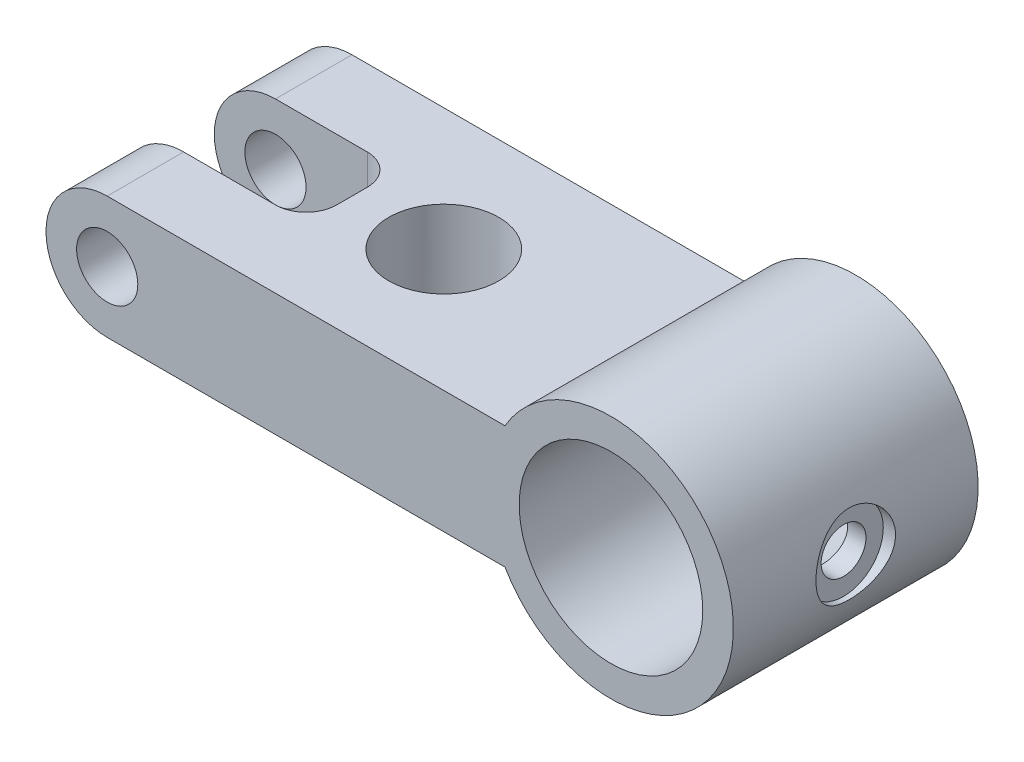
ISO-10303-21;
HEADER;
FILE_DESCRIPTION(('STEP AP214'),'2;1');
FILE_NAME('part.step','',(''),(''),'','','');
FILE_SCHEMA(('AUTOMOTIVE_DESIGN { 1 0 10303 214 1 1 1 1 }'));
ENDSEC;
DATA;
#1=APPLICATION_CONTEXT('core data for automotive mechanical design processes');
#2=APPLICATION_PROTOCOL_DEFINITION('international standard','automotive_design',2000,#1);
#3=PRODUCT_CONTEXT('',#1,'mechanical');
#4=PRODUCT('Part','Part','',(#3));
#5=PRODUCT_RELATED_PRODUCT_CATEGORY('part','',(#4));
#6=PRODUCT_DEFINITION_FORMATION('','',#4);
#7=PRODUCT_DEFINITION_CONTEXT('part definition',#1,'design');
#8=PRODUCT_DEFINITION('design','',#6,#7);
#9=PRODUCT_DEFINITION_SHAPE('','',#8);
#10=(LENGTH_UNIT() NAMED_UNIT(*) SI_UNIT(.MILLI.,.METRE.));
#11=(NAMED_UNIT(*) PLANE_ANGLE_UNIT() SI_UNIT($,.RADIAN.));
#12=(NAMED_UNIT(*) SI_UNIT($,.STERADIAN.) SOLID_ANGLE_UNIT());
#13=UNCERTAINTY_MEASURE_WITH_UNIT(LENGTH_MEASURE(1.E-05),#10,'distance_accuracy_value','');
#14=(GEOMETRIC_REPRESENTATION_CONTEXT(3) GLOBAL_UNCERTAINTY_ASSIGNED_CONTEXT((#13)) GLOBAL_UNIT_ASSIGNED_CONTEXT((#10,
#11,#12)) REPRESENTATION_CONTEXT('',''));
#15=CARTESIAN_POINT('',(0.,0.,0.));
#16=DIRECTION('',(0.,0.,1.));
#17=DIRECTION('',(1.,0.,0.));
#18=AXIS2_PLACEMENT_3D('',#15,#16,#17);
#19=CARTESIAN_POINT('',(-27.1865777132335,7.10450872831006E-06,7.62000052926407));
#20=DIRECTION('',(0.,0.,-1.));
#21=DIRECTION('',(-1.,0.,0.));
#22=AXIS2_PLACEMENT_3D('',#19,#20,#21);
#23=CYLINDRICAL_SURFACE('',#22,3.81);
#24=DIRECTION('',(0.,0.,-1.));
#25=VECTOR('',#24,1.);
#26=CARTESIAN_POINT('',(-27.1865777132335,3.81000710450872,7.62000052926407));
#27=LINE('',#26,#25);
#28=CARTESIAN_POINT('',(-27.1865777132335,3.81000710450872,7.62000052926407));
#29=VERTEX_POINT('',#28);
#30=CARTESIAN_POINT('',(-27.1865777132335,3.81000710450872,2.85750052926407));
#31=VERTEX_POINT('',#30);
#32=EDGE_CURVE('E152',#29,#31,#27,.T.);
#33=ORIENTED_EDGE('',*,*,#32,.T.);
#34=CARTESIAN_POINT('',(-27.1865777132335,7.10450872831006E-06,2.85750052926407));
#35=DIRECTION('',(0.,0.,1.));
#36=DIRECTION('',(1.,0.,0.));
#37=AXIS2_PLACEMENT_3D('',#34,#35,#36);
#38=CIRCLE('',#37,3.81);
#39=CARTESIAN_POINT('',(-27.1865777132335,-3.80999289549127,2.85750052926407));
#40=VERTEX_POINT('',#39);
#41=EDGE_CURVE('E167',#31,#40,#38,.T.);
#42=ORIENTED_EDGE('',*,*,#41,.T.);
#43=DIRECTION('',(0.,0.,-1.));
#44=VECTOR('',#43,1.);
#45=CARTESIAN_POINT('',(-27.1865777132335,-3.80999289549127,7.62000052926407));
#46=LINE('',#45,#44);
#47=CARTESIAN_POINT('',(-27.1865777132335,-3.80999289549127,7.62000052926407));
#48=VERTEX_POINT('',#47);
#49=EDGE_CURVE('E153',#48,#40,#46,.T.);
#50=ORIENTED_EDGE('',*,*,#49,.F.);
#51=CARTESIAN_POINT('',(-27.1865777132335,7.10450872831006E-06,7.62000052926407));
#52=DIRECTION('',(0.,0.,1.));
#53=DIRECTION('',(1.,0.,0.));
#54=AXIS2_PLACEMENT_3D('',#51,#52,#53);
#55=CIRCLE('',#54,3.81);
#56=EDGE_CURVE('E249',#29,#48,#55,.T.);
#57=ORIENTED_EDGE('',*,*,#56,.F.);
#58=EDGE_LOOP('',(#33,#42,#50,#57));
#59=FACE_BOUND('',#58,.T.);
#60=ADVANCED_FACE('F43',(#59),#23,.T.);
#61=CARTESIAN_POINT('',(-27.1865777132335,7.10450872831006E-06,7.62000052926407));
#62=DIRECTION('',(0.,0.,-1.));
#63=DIRECTION('',(-1.,0.,0.));
#64=AXIS2_PLACEMENT_3D('',#61,#62,#63);
#65=CYLINDRICAL_SURFACE('',#64,1.905);
#66=CARTESIAN_POINT('',(-27.1865777132335,7.10450872831006E-06,2.85750052926407));
#67=DIRECTION('',(0.,0.,1.));
#68=DIRECTION('',(1.,0.,0.));
#69=AXIS2_PLACEMENT_3D('',#66,#67,#68);
#70=CIRCLE('',#69,1.905);
#71=CARTESIAN_POINT('',(-25.2815777132335,7.10450872831006E-06,2.85750052926407));
#72=VERTEX_POINT('',#71);
#73=EDGE_CURVE('E145',#72,#72,#70,.T.);
#74=ORIENTED_EDGE('',*,*,#73,.F.);
#75=EDGE_LOOP('',(#74));
#76=FACE_BOUND('',#75,.T.);
#77=CARTESIAN_POINT('',(-27.1865777132335,7.10450872831006E-06,7.62000052926407));
#78=DIRECTION('',(0.,0.,1.));
#79=DIRECTION('',(1.,0.,0.));
#80=AXIS2_PLACEMENT_3D('',#77,#78,#79);
#81=CIRCLE('',#80,1.905);
#82=CARTESIAN_POINT('',(-25.2815777132335,7.10450872831006E-06,7.62000052926407));
#83=VERTEX_POINT('',#82);
#84=EDGE_CURVE('E277',#83,#83,#81,.T.);
#85=ORIENTED_EDGE('',*,*,#84,.T.);
#86=EDGE_LOOP('',(#85));
#87=FACE_BOUND('',#86,.T.);
#88=ADVANCED_FACE('F226',(#76,#87),#65,.F.);
#89=CARTESIAN_POINT('',(4.17753586360394,7.10450872446906E-06,7.62000052926407));
#90=DIRECTION('',(0.,0.,-1.));
#91=DIRECTION('',(-1.,0.,0.));
#92=AXIS2_PLACEMENT_3D('',#89,#90,#91);
#93=CYLINDRICAL_SURFACE('',#92,7.62);
#94=CARTESIAN_POINT('',(11.7975358636039,7.10450872446906E-06,-2.47649947073593));
#95=CARTESIAN_POINT('',(11.7975357826381,-0.135308385298439,-2.47649945465275));
#96=CARTESIAN_POINT('',(11.7938979185261,-0.270625424655494,-2.46537277457056));
#97=CARTESIAN_POINT('',(11.7797432994246,-0.53728527703146,-2.42128825268884));
#98=CARTESIAN_POINT('',(11.7692254909604,-0.668627478189943,-2.38832706752406));
#99=CARTESIAN_POINT('',(11.7424563395762,-0.923454467514577,-2.30181460762838));
#100=CARTESIAN_POINT('',(11.7262142982903,-1.04695162157486,-2.24829672404955));
#101=CARTESIAN_POINT('',(11.6896622777681,-1.28321813499528,-2.12233737607667));
#102=CARTESIAN_POINT('',(11.6693515598757,-1.39598554091028,-2.04989247481097));
#103=CARTESIAN_POINT('',(11.6260548673322,-1.61132633384055,-1.8856133820311));
#104=CARTESIAN_POINT('',(11.6030071342359,-1.713494958762,-1.79326497706308));
#105=CARTESIAN_POINT('',(11.5571810114411,-1.90120075746504,-1.59289420257742));
#106=CARTESIAN_POINT('',(11.5344026781156,-1.98673450618695,-1.48486861316365));
#107=CARTESIAN_POINT('',(11.4910217906974,-2.14100564016149,-1.25262305635172));
#108=CARTESIAN_POINT('',(11.4704948950855,-2.20922523936901,-1.12804365878957));
#109=CARTESIAN_POINT('',(11.4348759144788,-2.32357387549655,-0.868405226777328));
#110=CARTESIAN_POINT('',(11.4197822644195,-2.36970927510929,-0.733349223795549));
#111=CARTESIAN_POINT('',(11.3973872786997,-2.43707662409425,-0.461180161386205));
#112=CARTESIAN_POINT('',(11.3898502595703,-2.4590639822365,-0.324274034547668));
#113=CARTESIAN_POINT('',(11.3827236947051,-2.47987205407763,-0.0485244254971645));
#114=CARTESIAN_POINT('',(11.3831318352319,-2.47869951224973,0.0903184809292623));
#115=CARTESIAN_POINT('',(11.3916423250482,-2.45380933764312,0.359637918972985));
#116=CARTESIAN_POINT('',(11.3994118217881,-2.43106696513025,0.490216903975059));
#117=CARTESIAN_POINT('',(11.4212265436741,-2.36526971734732,0.7455944664332));
#118=CARTESIAN_POINT('',(11.4352724856073,-2.32221252203753,0.870392381878211));
#119=CARTESIAN_POINT('',(11.4683018768012,-2.21634917540947,1.11292459863787));
#120=CARTESIAN_POINT('',(11.4873585280072,-2.15324707521822,1.23051932165575));
#121=CARTESIAN_POINT('',(11.5282302997085,-2.00929061820791,1.4537638876748));
#122=CARTESIAN_POINT('',(11.5500461842225,-1.9284313399259,1.55941040686811));
#123=CARTESIAN_POINT('',(11.5952983565057,-1.74653047343564,1.76125365292513));
#124=CARTESIAN_POINT('',(11.6187614160838,-1.64468835301945,1.85672435397235));
#125=CARTESIAN_POINT('',(11.6637170058308,-1.4261490085516,2.02941612968328));
#126=CARTESIAN_POINT('',(11.6852093651251,-1.30945049843009,2.10663562274351));
#127=CARTESIAN_POINT('',(11.724060329062,-1.06302858726855,2.24117936950034));
#128=CARTESIAN_POINT('',(11.7413798838933,-0.933197160808347,2.29831781623617));
#129=CARTESIAN_POINT('',(11.7696510463115,-0.665069163534495,2.38972210167723));
#130=CARTESIAN_POINT('',(11.780604752005,-0.526775398433743,2.42399547698434));
#131=CARTESIAN_POINT('',(11.794566501532,-0.251801354797691,2.46743067979948));
#132=CARTESIAN_POINT('',(11.7978850057879,-0.115291705395542,2.47757428164409));
#133=CARTESIAN_POINT('',(11.7971283088171,0.157500886784682,2.47524704279039));
#134=CARTESIAN_POINT('',(11.793054286432,0.293783862240457,2.46277980770601));
#135=CARTESIAN_POINT('',(11.7781748981777,0.558383189884687,2.4163664416989));
#136=CARTESIAN_POINT('',(11.7675561588493,0.686815447200849,2.38301541718603));
#137=CARTESIAN_POINT('',(11.7408456783651,0.936216501346425,2.29651792768231));
#138=CARTESIAN_POINT('',(11.7247532468753,1.05718435450152,2.24336896572401));
#139=CARTESIAN_POINT('',(11.6882259656174,1.29166610727004,2.11727294934539));
#140=CARTESIAN_POINT('',(11.6676906391212,1.40491046194166,2.0438545887094));
#141=CARTESIAN_POINT('',(11.6246143096003,1.61779521307799,1.87986222243646));
#142=CARTESIAN_POINT('',(11.6020727223563,1.71743162538752,1.78928321092752));
#143=CARTESIAN_POINT('',(11.5562972898311,1.90473352561935,1.58892218399437));
#144=CARTESIAN_POINT('',(11.5330754430041,1.99169861750368,1.47848113244114));
#145=CARTESIAN_POINT('',(11.4895686046606,2.14593836619642,1.24407144524083));
#146=CARTESIAN_POINT('',(11.4692836058366,2.21321307199843,1.12010284325406));
#147=CARTESIAN_POINT('',(11.4341580792776,2.32580229053359,0.862239694244781));
#148=CARTESIAN_POINT('',(11.4193020691814,2.3711793713154,0.728374703351247));
#149=CARTESIAN_POINT('',(11.3968948423183,2.43856023350556,0.454314239705794));
#150=CARTESIAN_POINT('',(11.3893405471779,2.46057386523324,0.314121460839329));
#151=CARTESIAN_POINT('',(11.3827303955588,2.47985879838908,0.038755759772532));
#152=CARTESIAN_POINT('',(11.3832771543957,2.47828699648455,-0.0963275430761654));
#153=CARTESIAN_POINT('',(11.3918319505753,2.45327078674456,-0.364200415815043));
#154=CARTESIAN_POINT('',(11.3998395845286,2.42982756143831,-0.496990109319188));
#155=CARTESIAN_POINT('',(11.4221252243804,2.36253530347235,-0.754251535300813));
#156=CARTESIAN_POINT('',(11.4362933418481,2.31904311368515,-0.878826862261168));
#157=CARTESIAN_POINT('',(11.4692679164598,2.21317303374441,-1.11900955842777));
#158=CARTESIAN_POINT('',(11.4880753696749,2.1507910872822,-1.23461499477184));
#159=CARTESIAN_POINT('',(11.5291906190133,2.00586450780742,-1.45881508253507));
#160=CARTESIAN_POINT('',(11.5516119271201,1.92258561491265,-1.56691418402344));
#161=CARTESIAN_POINT('',(11.5969346929276,1.7394909349073,-1.7679773218571));
#162=CARTESIAN_POINT('',(11.6198362817994,1.63967057734341,-1.86093716106686));
#163=CARTESIAN_POINT('',(11.6645383045584,1.42196581621768,-2.03247963097817));
#164=CARTESIAN_POINT('',(11.6862684524746,1.30355668492791,-2.11041683090074));
#165=CARTESIAN_POINT('',(11.7252532925136,1.05461631616283,-2.24518724883802));
#166=CARTESIAN_POINT('',(11.7425093836793,0.924088885475285,-2.30202706643496));
#167=CARTESIAN_POINT('',(11.7697202356107,0.662819378599128,-2.38988524416066));
#168=CARTESIAN_POINT('',(11.7800558179578,0.532575003155798,-2.42226594130674));
#169=CARTESIAN_POINT('',(11.7939628461981,0.268222659596242,-2.46557044273815));
#170=CARTESIAN_POINT('',(11.7975359438476,0.134115643067804,-2.47649948667566));
#171=CARTESIAN_POINT('',(11.7975358636039,7.10450872446906E-06,-2.47649947073593));
#172=B_SPLINE_CURVE_WITH_KNOTS('',3,(#94,#95,#96,#97,#98,#99,#100,#101,#102,#103,#104,#105,#106,
#107,#108,#109,#110,#111,#112,#113,#114,#115,#116,#117,#118,#119,#120,#121,#122,#123,#124,#125,
#126,#127,#128,#129,#130,#131,#132,#133,#134,#135,#136,#137,#138,#139,#140,#141,#142,#143,#144,
#145,#146,#147,#148,#149,#150,#151,#152,#153,#154,#155,#156,#157,#158,#159,#160,#161,#162,#163,
#164,#165,#166,#167,#168,#169,#170,#171),.UNSPECIFIED.,.T.,.F.,(4,2,2,2,2,2,2,2,2,2,2,2,2,2,2,2,
2,2,2,2,2,2,2,2,2,2,2,2,2,2,2,2,2,2,2,2,2,2,4),(0.,0.405453190556064,0.810968479682289,
1.2158278390968,1.62076076625213,2.03778075787879,2.45488652169308,2.88329172091976,
3.31157341765306,3.72603802559034,4.14038193765993,4.5368422185764,4.93334778791786,
5.33600316743648,5.73877028543643,6.16146224988921,6.58419083033866,7.01073379853934,
7.43713610350531,7.84586813309365,8.25453499037872,8.65205555447525,9.04962627188592,
9.45735866203174,9.86521017397543,10.2906274596004,10.7160436866929,11.140237067702,
11.5642515323971,11.9675385234027,12.3708037110258,12.7671531270057,13.163587713858,
13.5766053570092,13.9897373089599,14.4178863986525,14.8459014436945,15.2478363667614,
15.6496731033914),.UNSPECIFIED.);
#173=CARTESIAN_POINT('',(11.7975358636039,7.10450872446906E-06,-2.47649947073593));
#174=VERTEX_POINT('',#173);
#175=EDGE_CURVE('E179',#174,#174,#172,.T.);
#176=ORIENTED_EDGE('',*,*,#175,.T.);
#177=EDGE_LOOP('',(#176));
#178=FACE_BOUND('',#177,.T.);
#179=CARTESIAN_POINT('',(4.17753586360394,7.10450872446906E-06,-7.61999947073593));
#180=DIRECTION('',(0.,0.,1.));
#181=DIRECTION('',(1.,0.,0.));
#182=AXIS2_PLACEMENT_3D('',#179,#180,#181);
#183=CIRCLE('',#182,7.62);
#184=CARTESIAN_POINT('',(-2.42157771323348,-3.80999289549128,-7.61999947073593));
#185=VERTEX_POINT('',#184);
#186=CARTESIAN_POINT('',(-2.42157771323348,3.81000710450872,-7.61999947073593));
#187=VERTEX_POINT('',#186);
#188=EDGE_CURVE('E283',#185,#187,#183,.T.);
#189=ORIENTED_EDGE('',*,*,#188,.T.);
#190=DIRECTION('',(0.,0.,-1.));
#191=VECTOR('',#190,1.);
#192=CARTESIAN_POINT('',(-2.42157771323348,3.81000710450872,7.62000052926407));
#193=LINE('',#192,#191);
#194=CARTESIAN_POINT('',(-2.42157771323348,3.81000710450872,7.62000052926407));
#195=VERTEX_POINT('',#194);
#196=EDGE_CURVE('E156',#195,#187,#193,.T.);
#197=ORIENTED_EDGE('',*,*,#196,.F.);
#198=CARTESIAN_POINT('',(4.17753586360394,7.10450872446906E-06,7.62000052926407));
#199=DIRECTION('',(0.,0.,1.));
#200=DIRECTION('',(1.,0.,0.));
#201=AXIS2_PLACEMENT_3D('',#198,#199,#200);
#202=CIRCLE('',#201,7.62);
#203=CARTESIAN_POINT('',(-2.42157771323348,-3.80999289549128,7.62000052926407));
#204=VERTEX_POINT('',#203);
#205=EDGE_CURVE('E270',#204,#195,#202,.T.);
#206=ORIENTED_EDGE('',*,*,#205,.F.);
#207=DIRECTION('',(0.,0.,-1.));
#208=VECTOR('',#207,1.);
#209=CARTESIAN_POINT('',(-2.42157771323348,-3.80999289549128,7.62000052926407));
#210=LINE('',#209,#208);
#211=EDGE_CURVE('E280',#204,#185,#210,.T.);
#212=ORIENTED_EDGE('',*,*,#211,.T.);
#213=EDGE_LOOP('',(#189,#197,#206,#212));
#214=FACE_BOUND('',#213,.T.);
#215=ADVANCED_FACE('F187',(#178,#214),#93,.T.);
#216=CARTESIAN_POINT('',(4.17753586360394,3.81000710450873,7.62000052926407));
#217=DIRECTION('',(0.,-1.,0.));
#218=DIRECTION('',(1.,0.,0.));
#219=AXIS2_PLACEMENT_3D('',#216,#217,#218);
#220=PLANE('',#219);
#221=CARTESIAN_POINT('',(-13.8515777132335,3.81000710450873,5.29264071780693E-07));
#222=DIRECTION('',(0.,1.,0.));
#223=DIRECTION('',(0.,0.,1.));
#224=AXIS2_PLACEMENT_3D('',#221,#222,#223);
#225=CIRCLE('',#224,3.42899999999998);
#226=CARTESIAN_POINT('',(-13.8515777132335,3.81000710450873,3.42900052926405));
#227=VERTEX_POINT('',#226);
#228=EDGE_CURVE('E260',#227,#227,#225,.T.);
#229=ORIENTED_EDGE('',*,*,#228,.F.);
#230=EDGE_LOOP('',(#229));
#231=FACE_BOUND('',#230,.T.);
#232=DIRECTION('',(0.,0.,-1.));
#233=VECTOR('',#232,1.);
#234=CARTESIAN_POINT('',(-19.5665777132335,3.81000710450872,-2.85749947073593));
#235=LINE('',#234,#233);
#236=CARTESIAN_POINT('',(-19.5665777132335,3.81000710450872,0.95250052926407));
#237=VERTEX_POINT('',#236);
#238=CARTESIAN_POINT('',(-19.5665777132335,3.81000710450872,-0.952499470735928));
#239=VERTEX_POINT('',#238);
#240=EDGE_CURVE('E136',#237,#239,#235,.T.);
#241=ORIENTED_EDGE('',*,*,#240,.F.);
#242=CARTESIAN_POINT('',(-21.4715777132335,3.81000710450872,0.952500529264072));
#243=DIRECTION('',(0.,-1.,0.));
#244=DIRECTION('',(1.,0.,0.));
#245=AXIS2_PLACEMENT_3D('',#242,#243,#244);
#246=CIRCLE('',#245,1.905);
#247=CARTESIAN_POINT('',(-21.4715777132335,3.81000710450872,2.85750052926407));
#248=VERTEX_POINT('',#247);
#249=EDGE_CURVE('E57',#237,#248,#246,.T.);
#250=ORIENTED_EDGE('',*,*,#249,.T.);
#251=DIRECTION('',(1.,0.,0.));
#252=VECTOR('',#251,1.);
#253=CARTESIAN_POINT('',(-42.4265777132335,3.81000710450872,2.85750052926407));
#254=LINE('',#253,#252);
#255=EDGE_CURVE('E135',#31,#248,#254,.T.);
#256=ORIENTED_EDGE('',*,*,#255,.F.);
#257=ORIENTED_EDGE('',*,*,#32,.F.);
#258=DIRECTION('',(-1.,0.,0.));
#259=VECTOR('',#258,1.);
#260=CARTESIAN_POINT('',(4.17753586360394,3.81000710450873,7.62000052926407));
#261=LINE('',#260,#259);
#262=EDGE_CURVE('E250',#195,#29,#261,.T.);
#263=ORIENTED_EDGE('',*,*,#262,.F.);
#264=ORIENTED_EDGE('',*,*,#196,.T.);
#265=DIRECTION('',(-1.,0.,0.));
#266=VECTOR('',#265,1.);
#267=CARTESIAN_POINT('',(4.17753586360394,3.81000710450873,-7.61999947073593));
#268=LINE('',#267,#266);
#269=CARTESIAN_POINT('',(-27.1865777132335,3.81000710450872,-7.61999947073593));
#270=VERTEX_POINT('',#269);
#271=EDGE_CURVE('E150',#187,#270,#268,.T.);
#272=ORIENTED_EDGE('',*,*,#271,.T.);
#273=CARTESIAN_POINT('',(-27.1865777132335,3.81000710450872,-2.85749947073593));
#274=VERTEX_POINT('',#273);
#275=EDGE_CURVE('E142',#274,#270,#27,.T.);
#276=ORIENTED_EDGE('',*,*,#275,.F.);
#277=DIRECTION('',(-1.,0.,0.));
#278=VECTOR('',#277,1.);
#279=CARTESIAN_POINT('',(-42.4265777132335,3.81000710450872,-2.85749947073593));
#280=LINE('',#279,#278);
#281=CARTESIAN_POINT('',(-21.4715777132335,3.81000710450872,-2.85749947073593));
#282=VERTEX_POINT('',#281);
#283=EDGE_CURVE('E126',#282,#274,#280,.T.);
#284=ORIENTED_EDGE('',*,*,#283,.F.);
#285=CARTESIAN_POINT('',(-21.4715777132335,3.81000710450872,-0.952499470735928));
#286=DIRECTION('',(0.,-1.,0.));
#287=DIRECTION('',(1.,0.,0.));
#288=AXIS2_PLACEMENT_3D('',#285,#286,#287);
#289=CIRCLE('',#288,1.905);
#290=EDGE_CURVE('E175',#282,#239,#289,.T.);
#291=ORIENTED_EDGE('',*,*,#290,.T.);
#292=EDGE_LOOP('',(#241,#250,#256,#257,#263,#264,#272,#276,#284,#291));
#293=FACE_BOUND('',#292,.T.);
#294=ADVANCED_FACE('F148',(#231,#293),#220,.F.);
#295=CARTESIAN_POINT('',(-27.1865777132335,-3.80999289549127,-2.85749947073593));
#296=VERTEX_POINT('',#295);
#297=CARTESIAN_POINT('',(-27.1865777132335,-3.80999289549127,-7.61999947073593));
#298=VERTEX_POINT('',#297);
#299=EDGE_CURVE('E144',#296,#298,#46,.T.);
#300=ORIENTED_EDGE('',*,*,#299,.F.);
#301=CARTESIAN_POINT('',(-27.1865777132335,7.10450872831006E-06,-2.85749947073593));
#302=DIRECTION('',(0.,0.,-1.));
#303=DIRECTION('',(-1.,0.,0.));
#304=AXIS2_PLACEMENT_3D('',#301,#302,#303);
#305=CIRCLE('',#304,3.81);
#306=EDGE_CURVE('E130',#296,#274,#305,.T.);
#307=ORIENTED_EDGE('',*,*,#306,.T.);
#308=ORIENTED_EDGE('',*,*,#275,.T.);
#309=CARTESIAN_POINT('',(-27.1865777132335,7.10450872831006E-06,-7.61999947073593));
#310=DIRECTION('',(0.,0.,1.));
#311=DIRECTION('',(1.,0.,0.));
#312=AXIS2_PLACEMENT_3D('',#309,#310,#311);
#313=CIRCLE('',#312,3.81);
#314=EDGE_CURVE('E287',#270,#298,#313,.T.);
#315=ORIENTED_EDGE('',*,*,#314,.T.);
#316=EDGE_LOOP('',(#300,#307,#308,#315));
#317=FACE_BOUND('',#316,.T.);
#318=ADVANCED_FACE('F140',(#317),#23,.T.);
#319=CARTESIAN_POINT('',(4.17753586360394,-3.80999289549128,7.62000052926407));
#320=DIRECTION('',(0.,1.,0.));
#321=DIRECTION('',(-1.,0.,0.));
#322=AXIS2_PLACEMENT_3D('',#319,#320,#321);
#323=PLANE('',#322);
#324=CARTESIAN_POINT('',(-13.8515777132335,-3.80999289549127,5.29264071780693E-07));
#325=DIRECTION('',(0.,1.,0.));
#326=DIRECTION('',(-1.,0.,0.));
#327=AXIS2_PLACEMENT_3D('',#324,#325,#326);
#328=CIRCLE('',#327,3.42899999999999);
#329=CARTESIAN_POINT('',(-17.2805777132335,-3.80999289549127,5.29264071780693E-07));
#330=VERTEX_POINT('',#329);
#331=EDGE_CURVE('E263',#330,#330,#328,.T.);
#332=ORIENTED_EDGE('',*,*,#331,.T.);
#333=EDGE_LOOP('',(#332));
#334=FACE_BOUND('',#333,.T.);
#335=ORIENTED_EDGE('',*,*,#49,.T.);
#336=DIRECTION('',(-1.,0.,0.));
#337=VECTOR('',#336,1.);
#338=CARTESIAN_POINT('',(-42.4265777132335,-3.80999289549127,2.85750052926407));
#339=LINE('',#338,#337);
#340=CARTESIAN_POINT('',(-21.4715777132335,-3.80999289549127,2.85750052926407));
#341=VERTEX_POINT('',#340);
#342=EDGE_CURVE('E252',#341,#40,#339,.T.);
#343=ORIENTED_EDGE('',*,*,#342,.F.);
#344=CARTESIAN_POINT('',(-21.4715777132335,-3.80999289549127,0.952500529264072));
#345=DIRECTION('',(0.,1.,0.));
#346=DIRECTION('',(-1.,0.,0.));
#347=AXIS2_PLACEMENT_3D('',#344,#345,#346);
#348=CIRCLE('',#347,1.905);
#349=CARTESIAN_POINT('',(-19.5665777132335,-3.80999289549128,0.952500529264072));
#350=VERTEX_POINT('',#349);
#351=EDGE_CURVE('E11',#341,#350,#348,.T.);
#352=ORIENTED_EDGE('',*,*,#351,.T.);
#353=DIRECTION('',(0.,0.,1.));
#354=VECTOR('',#353,1.);
#355=CARTESIAN_POINT('',(-19.5665777132335,-3.80999289549128,-2.85749947073593));
#356=LINE('',#355,#354);
#357=CARTESIAN_POINT('',(-19.5665777132335,-3.80999289549128,-0.952499470735928));
#358=VERTEX_POINT('',#357);
#359=EDGE_CURVE('E254',#358,#350,#356,.T.);
#360=ORIENTED_EDGE('',*,*,#359,.F.);
#361=CARTESIAN_POINT('',(-21.4715777132335,-3.80999289549127,-0.952499470735928));
#362=DIRECTION('',(0.,1.,0.));
#363=DIRECTION('',(-1.,0.,0.));
#364=AXIS2_PLACEMENT_3D('',#361,#362,#363);
#365=CIRCLE('',#364,1.905);
#366=CARTESIAN_POINT('',(-21.4715777132335,-3.80999289549127,-2.85749947073593));
#367=VERTEX_POINT('',#366);
#368=EDGE_CURVE('E177',#358,#367,#365,.T.);
#369=ORIENTED_EDGE('',*,*,#368,.T.);
#370=DIRECTION('',(1.,0.,0.));
#371=VECTOR('',#370,1.);
#372=CARTESIAN_POINT('',(-42.4265777132335,-3.80999289549127,-2.85749947073593));
#373=LINE('',#372,#371);
#374=EDGE_CURVE('E164',#296,#367,#373,.T.);
#375=ORIENTED_EDGE('',*,*,#374,.F.);
#376=ORIENTED_EDGE('',*,*,#299,.T.);
#377=DIRECTION('',(1.,0.,0.));
#378=VECTOR('',#377,1.);
#379=CARTESIAN_POINT('',(4.17753586360394,-3.80999289549128,-7.61999947073593));
#380=LINE('',#379,#378);
#381=EDGE_CURVE('E289',#298,#185,#380,.T.);
#382=ORIENTED_EDGE('',*,*,#381,.T.);
#383=ORIENTED_EDGE('',*,*,#211,.F.);
#384=DIRECTION('',(1.,0.,0.));
#385=VECTOR('',#384,1.);
#386=CARTESIAN_POINT('',(4.17753586360394,-3.80999289549128,7.62000052926407));
#387=LINE('',#386,#385);
#388=EDGE_CURVE('E275',#48,#204,#387,.T.);
#389=ORIENTED_EDGE('',*,*,#388,.F.);
#390=EDGE_LOOP('',(#335,#343,#352,#360,#369,#375,#376,#382,#383,#389));
#391=FACE_BOUND('',#390,.T.);
#392=ADVANCED_FACE('F227',(#334,#391),#323,.F.);
#393=CARTESIAN_POINT('',(4.17753586360394,7.10450872446906E-06,7.62000052926407));
#394=DIRECTION('',(0.,0.,-1.));
#395=DIRECTION('',(-1.,0.,0.));
#396=AXIS2_PLACEMENT_3D('',#393,#394,#395);
#397=CYLINDRICAL_SURFACE('',#396,5.715);
#398=CARTESIAN_POINT('',(9.89253586359953,0.,-1.397));
#399=CARTESIAN_POINT('',(9.89253442751891,-0.0772405132076796,-1.39699773503587));
#400=CARTESIAN_POINT('',(9.89095410644714,-0.154506684437052,-1.39057245820809));
#401=CARTESIAN_POINT('',(9.8848031077942,-0.306828236996191,-1.36507739211096));
#402=CARTESIAN_POINT('',(9.88023065310038,-0.381882276776937,-1.34600008835475));
#403=CARTESIAN_POINT('',(9.86860222960826,-0.527557598616563,-1.29584682652215));
#404=CARTESIAN_POINT('',(9.86154917266797,-0.598183964068113,-1.26478493244197));
#405=CARTESIAN_POINT('',(9.8457125568625,-0.733222929246752,-1.19159282444749));
#406=CARTESIAN_POINT('',(9.83692895837301,-0.797635386643265,-1.14946235708798));
#407=CARTESIAN_POINT('',(9.81839244435651,-0.919690970642992,-1.0544496235198));
#408=CARTESIAN_POINT('',(9.8086251048201,-0.977193840218526,-1.00138998346094));
#409=CARTESIAN_POINT('',(9.78931882908088,-1.08257945123746,-0.886405023418126));
#410=CARTESIAN_POINT('',(9.77977991768003,-1.13046115218007,-0.824478745772583));
#411=CARTESIAN_POINT('',(9.76186574188592,-1.21589720399243,-0.692439062094055));
#412=CARTESIAN_POINT('',(9.75350882315095,-1.25329607913832,-0.622222341260787));
#413=CARTESIAN_POINT('',(9.73911460340592,-1.31570550632398,-0.476261547854906));
#414=CARTESIAN_POINT('',(9.73307694942035,-1.34071794365866,-0.40051831846699));
#415=CARTESIAN_POINT('',(9.72415288057301,-1.37716877593383,-0.247193131713814));
#416=CARTESIAN_POINT('',(9.72120816719957,-1.38885866022211,-0.169674433153799));
#417=CARTESIAN_POINT('',(9.71862878032256,-1.39911566014667,-0.0137245569361576));
#418=CARTESIAN_POINT('',(9.71899359338534,-1.39768481130817,0.0647064772979749));
#419=CARTESIAN_POINT('',(9.72293956473667,-1.3819419340608,0.218338251836522));
#420=CARTESIAN_POINT('',(9.72644625112475,-1.36792814295549,0.293571762817432));
#421=CARTESIAN_POINT('',(9.736162349846,-1.32789232570387,0.440586258950579));
#422=CARTESIAN_POINT('',(9.7423719471605,-1.30186947767648,0.512367007429814));
#423=CARTESIAN_POINT('',(9.756863490956,-1.23829645934658,0.651245287893148));
#424=CARTESIAN_POINT('',(9.76516496607267,-1.20063685976947,0.718290604241502));
#425=CARTESIAN_POINT('',(9.78289370453924,-1.11493595940503,0.845217796692278));
#426=CARTESIAN_POINT('',(9.79232115676505,-1.06689291575995,0.905098467586625));
#427=CARTESIAN_POINT('',(9.81155431050076,-0.960237709348095,1.01770721791008));
#428=CARTESIAN_POINT('',(9.82136332365238,-0.901373496610897,1.07019629541301));
#429=CARTESIAN_POINT('',(9.84002260194346,-0.775561681845844,1.16460222061861));
#430=CARTESIAN_POINT('',(9.84887284026892,-0.708613853854799,1.20651877268378));
#431=CARTESIAN_POINT('',(9.86465834824048,-0.56820343536825,1.27867209776027));
#432=CARTESIAN_POINT('',(9.87158746352495,-0.494720881352363,1.3088714551058));
#433=CARTESIAN_POINT('',(9.88270511840016,-0.343515414761289,1.35642325896718));
#434=CARTESIAN_POINT('',(9.88689415852429,-0.265793279448253,1.37377805189391));
#435=CARTESIAN_POINT('',(9.89198613146502,-0.110359529503928,1.39478634532169));
#436=CARTESIAN_POINT('',(9.89296715173672,-0.0326944236802612,1.39876549526639));
#437=CARTESIAN_POINT('',(9.89175429830465,0.122191667670404,1.39380075166292));
#438=CARTESIAN_POINT('',(9.88956069704209,0.199412690736953,1.38485796705567));
#439=CARTESIAN_POINT('',(9.88229498833556,0.350096784157909,1.35457198729583));
#440=CARTESIAN_POINT('',(9.87726384787642,0.423597459174446,1.33340517460725));
#441=CARTESIAN_POINT('',(9.86488921176317,0.56600188030137,1.2794723861725));
#442=CARTESIAN_POINT('',(9.85754548869562,0.634905173509109,1.24670526964284));
#443=CARTESIAN_POINT('',(9.8411721083702,0.767464135176644,1.1698621359915));
#444=CARTESIAN_POINT('',(9.83211573215548,0.831009725816198,1.12560205634739));
#445=CARTESIAN_POINT('',(9.8133658727043,0.949887634273946,1.02726593622398));
#446=CARTESIAN_POINT('',(9.80367228478021,1.00521859761949,0.973188280229304));
#447=CARTESIAN_POINT('',(9.78446151170825,1.10742862676421,0.855242986671645));
#448=CARTESIAN_POINT('',(9.77495375499916,1.15407974745396,0.791175957359072));
#449=CARTESIAN_POINT('',(9.75744526141816,1.23596681974058,0.655929224286288));
#450=CARTESIAN_POINT('',(9.74944445718576,1.27120328162122,0.584749838664834));
#451=CARTESIAN_POINT('',(9.73594219230977,1.32900124563608,0.437684833483001));
#452=CARTESIAN_POINT('',(9.73042597621264,1.35163777076887,0.361830123532833));
#453=CARTESIAN_POINT('',(9.72250047043965,1.38379608610217,0.207237197500048));
#454=CARTESIAN_POINT('',(9.7200905366895,1.39332059505073,0.128499582658468));
#455=CARTESIAN_POINT('',(9.71869800356317,1.39884720813855,-0.0273087755062376));
#456=CARTESIAN_POINT('',(9.71962321320647,1.39521303574705,-0.104366004629791));
#457=CARTESIAN_POINT('',(9.7245844358359,1.37535428178942,-0.25673334321458));
#458=CARTESIAN_POINT('',(9.72862039153949,1.35912993206388,-0.332043484821087));
#459=CARTESIAN_POINT('',(9.73929813073344,1.31474593835674,-0.478403296492427));
#460=CARTESIAN_POINT('',(9.74592562548141,1.28665167326225,-0.549473906513372));
#461=CARTESIAN_POINT('',(9.76104228800926,1.21937759053302,-0.685942351075425));
#462=CARTESIAN_POINT('',(9.76953170256621,1.18019630323506,-0.751339432047482));
#463=CARTESIAN_POINT('',(9.78768089096147,1.09070781808991,-0.876368793443127));
#464=CARTESIAN_POINT('',(9.79736461991883,1.04014693594387,-0.935816056195146));
#465=CARTESIAN_POINT('',(9.81666516207701,0.929832632597891,-1.04550080386895));
#466=CARTESIAN_POINT('',(9.82628195895238,0.870077045545678,-1.0957361127489));
#467=CARTESIAN_POINT('',(9.84456118850566,0.74183610547781,-1.18640624975841));
#468=CARTESIAN_POINT('',(9.85320448453064,0.673218920662509,-1.22665875568226));
#469=CARTESIAN_POINT('',(9.86836306088767,0.529988059378618,-1.29499327721465));
#470=CARTESIAN_POINT('',(9.8748799149061,0.4553788685207,-1.32308429805888));
#471=CARTESIAN_POINT('',(9.88405000294708,0.317383955510098,-1.36196972111541));
#472=CARTESIAN_POINT('',(9.88721082416897,0.254673876535631,-1.37507832951091));
#473=CARTESIAN_POINT('',(9.89145427817898,0.127981678414578,-1.39259410890222));
#474=CARTESIAN_POINT('',(9.89253705350167,0.0639996468162692,-1.39700187669524));
#475=CARTESIAN_POINT('',(9.89253586359953,0.,-1.397));
#476=B_SPLINE_CURVE_WITH_KNOTS('',3,(#398,#399,#400,#401,#402,#403,#404,#405,#406,#407,#408,
#409,#410,#411,#412,#413,#414,#415,#416,#417,#418,#419,#420,#421,#422,#423,#424,#425,#426,#427,
#428,#429,#430,#431,#432,#433,#434,#435,#436,#437,#438,#439,#440,#441,#442,#443,#444,#445,#446,
#447,#448,#449,#450,#451,#452,#453,#454,#455,#456,#457,#458,#459,#460,#461,#462,#463,#464,#465,
#466,#467,#468,#469,#470,#471,#472,#473,#474,#475),.UNSPECIFIED.,.T.,.F.,(4,2,2,2,2,2,2,2,2,2,2,
2,2,2,2,2,2,2,2,2,2,2,2,2,2,2,2,2,2,2,2,2,2,2,2,2,2,2,4),(0.,0.231487056479201,
0.463111724596546,0.694465402319831,0.925824377979184,1.16128505566868,1.39677118404118,
1.63558453696455,1.87436152979032,2.10855233244169,2.34270680379856,2.57145378008546,
2.80021641377978,3.03119934712087,3.26222108102475,3.49952991959955,3.73684539326023,
3.97491255205197,4.21293621062647,4.44512115844994,4.67728618169488,4.90618210472686,
5.13510054382941,5.36793937005308,5.60081654547815,5.8391403824985,6.07745356395924,
6.31433216378842,6.5511616399536,6.7814954266135,7.0118249719152,7.24090208074834,
7.47000956960949,7.70484536651912,7.93973656493176,8.17864531392057,8.41737685390056,
8.60919466459482,8.8009993179038),.UNSPECIFIED.);
#477=CARTESIAN_POINT('',(9.89253586359953,0.,-1.397));
#478=VERTEX_POINT('',#477);
#479=EDGE_CURVE('E47',#478,#478,#476,.T.);
#480=ORIENTED_EDGE('',*,*,#479,.F.);
#481=EDGE_LOOP('',(#480));
#482=FACE_BOUND('',#481,.T.);
#483=CARTESIAN_POINT('',(4.17753586360394,7.10450872446906E-06,7.62000052926407));
#484=DIRECTION('',(0.,0.,1.));
#485=DIRECTION('',(1.,0.,0.));
#486=AXIS2_PLACEMENT_3D('',#483,#484,#485);
#487=CIRCLE('',#486,5.715);
#488=CARTESIAN_POINT('',(9.89253586360394,7.10450872446906E-06,7.62000052926407));
#489=VERTEX_POINT('',#488);
#490=EDGE_CURVE('E267',#489,#489,#487,.T.);
#491=ORIENTED_EDGE('',*,*,#490,.T.);
#492=EDGE_LOOP('',(#491));
#493=FACE_BOUND('',#492,.T.);
#494=CARTESIAN_POINT('',(4.17753586360394,7.10450872446906E-06,-7.61999947073593));
#495=DIRECTION('',(0.,0.,1.));
#496=DIRECTION('',(1.,0.,0.));
#497=AXIS2_PLACEMENT_3D('',#494,#495,#496);
#498=CIRCLE('',#497,5.715);
#499=CARTESIAN_POINT('',(9.89253586360394,7.10450872446906E-06,-7.61999947073593));
#500=VERTEX_POINT('',#499);
#501=EDGE_CURVE('E266',#500,#500,#498,.T.);
#502=ORIENTED_EDGE('',*,*,#501,.F.);
#503=EDGE_LOOP('',(#502));
#504=FACE_BOUND('',#503,.T.);
#505=ADVANCED_FACE('F224',(#482,#493,#504),#397,.F.);
#506=CARTESIAN_POINT('',(-27.1865777132335,7.10450872831006E-06,-2.85749947073593));
#507=DIRECTION('',(0.,0.,-1.));
#508=DIRECTION('',(-1.,0.,0.));
#509=AXIS2_PLACEMENT_3D('',#506,#507,#508);
#510=CIRCLE('',#509,1.905);
#511=CARTESIAN_POINT('',(-29.0915777132335,7.10450872831006E-06,-2.85749947073593));
#512=VERTEX_POINT('',#511);
#513=EDGE_CURVE('E146',#512,#512,#510,.T.);
#514=ORIENTED_EDGE('',*,*,#513,.F.);
#515=EDGE_LOOP('',(#514));
#516=FACE_BOUND('',#515,.T.);
#517=CARTESIAN_POINT('',(-27.1865777132335,7.10450872831006E-06,-7.61999947073593));
#518=DIRECTION('',(0.,0.,1.));
#519=DIRECTION('',(1.,0.,0.));
#520=AXIS2_PLACEMENT_3D('',#517,#518,#519);
#521=CIRCLE('',#520,1.905);
#522=CARTESIAN_POINT('',(-25.2815777132335,7.10450872831006E-06,-7.61999947073593));
#523=VERTEX_POINT('',#522);
#524=EDGE_CURVE('E271',#523,#523,#521,.T.);
#525=ORIENTED_EDGE('',*,*,#524,.F.);
#526=EDGE_LOOP('',(#525));
#527=FACE_BOUND('',#526,.T.);
#528=ADVANCED_FACE('F217',(#516,#527),#65,.F.);
#529=CARTESIAN_POINT('',(4.17753586360394,7.10450872446906E-06,7.62000052926407));
#530=DIRECTION('',(0.,0.,1.));
#531=DIRECTION('',(1.,0.,0.));
#532=AXIS2_PLACEMENT_3D('',#529,#530,#531);
#533=PLANE('',#532);
#534=ORIENTED_EDGE('',*,*,#490,.F.);
#535=EDGE_LOOP('',(#534));
#536=FACE_BOUND('',#535,.T.);
#537=ORIENTED_EDGE('',*,*,#205,.T.);
#538=ORIENTED_EDGE('',*,*,#262,.T.);
#539=ORIENTED_EDGE('',*,*,#56,.T.);
#540=ORIENTED_EDGE('',*,*,#388,.T.);
#541=EDGE_LOOP('',(#537,#538,#539,#540));
#542=FACE_BOUND('',#541,.T.);
#543=ORIENTED_EDGE('',*,*,#84,.F.);
#544=EDGE_LOOP('',(#543));
#545=FACE_BOUND('',#544,.T.);
#546=ADVANCED_FACE('F214',(#536,#542,#545),#533,.T.);
#547=CARTESIAN_POINT('',(4.17753586360394,7.10450872446906E-06,-7.61999947073593));
#548=DIRECTION('',(0.,0.,1.));
#549=DIRECTION('',(1.,0.,0.));
#550=AXIS2_PLACEMENT_3D('',#547,#548,#549);
#551=PLANE('',#550);
#552=ORIENTED_EDGE('',*,*,#501,.T.);
#553=EDGE_LOOP('',(#552));
#554=FACE_BOUND('',#553,.T.);
#555=ORIENTED_EDGE('',*,*,#188,.F.);
#556=ORIENTED_EDGE('',*,*,#381,.F.);
#557=ORIENTED_EDGE('',*,*,#314,.F.);
#558=ORIENTED_EDGE('',*,*,#271,.F.);
#559=EDGE_LOOP('',(#555,#556,#557,#558));
#560=FACE_BOUND('',#559,.T.);
#561=ORIENTED_EDGE('',*,*,#524,.T.);
#562=EDGE_LOOP('',(#561));
#563=FACE_BOUND('',#562,.T.);
#564=ADVANCED_FACE('F212',(#554,#560,#563),#551,.F.);
#565=CARTESIAN_POINT('',(-13.8515777132335,3.81000710450872,5.29264071780693E-07));
#566=DIRECTION('',(0.,1.,0.));
#567=DIRECTION('',(0.,0.,1.));
#568=AXIS2_PLACEMENT_3D('',#565,#566,#567);
#569=CYLINDRICAL_SURFACE('',#568,3.42899999999999);
#570=ORIENTED_EDGE('',*,*,#228,.T.);
#571=EDGE_LOOP('',(#570));
#572=FACE_BOUND('',#571,.T.);
#573=ORIENTED_EDGE('',*,*,#331,.F.);
#574=EDGE_LOOP('',(#573));
#575=FACE_BOUND('',#574,.T.);
#576=ADVANCED_FACE('F200',(#572,#575),#569,.F.);
#577=CARTESIAN_POINT('',(-42.4265777132335,-27.3735415458962,2.85750052926407));
#578=DIRECTION('',(0.,0.,1.));
#579=DIRECTION('',(1.,0.,0.));
#580=AXIS2_PLACEMENT_3D('',#577,#578,#579);
#581=PLANE('',#580);
#582=ORIENTED_EDGE('',*,*,#73,.T.);
#583=EDGE_LOOP('',(#582));
#584=FACE_BOUND('',#583,.T.);
#585=ORIENTED_EDGE('',*,*,#255,.T.);
#586=DIRECTION('',(0.,1.,0.));
#587=VECTOR('',#586,1.);
#588=CARTESIAN_POINT('',(-21.4715777132335,-3.80999289549128,2.85750052926407));
#589=LINE('',#588,#587);
#590=EDGE_CURVE('E65',#248,#341,#589,.F.);
#591=ORIENTED_EDGE('',*,*,#590,.T.);
#592=ORIENTED_EDGE('',*,*,#342,.T.);
#593=ORIENTED_EDGE('',*,*,#41,.F.);
#594=EDGE_LOOP('',(#585,#591,#592,#593));
#595=FACE_BOUND('',#594,.T.);
#596=ADVANCED_FACE('F197',(#584,#595),#581,.F.);
#597=CARTESIAN_POINT('',(-42.4265777132335,-27.3735415458962,-2.85749947073593));
#598=DIRECTION('',(0.,0.,-1.));
#599=DIRECTION('',(-1.,0.,0.));
#600=AXIS2_PLACEMENT_3D('',#597,#598,#599);
#601=PLANE('',#600);
#602=ORIENTED_EDGE('',*,*,#513,.T.);
#603=EDGE_LOOP('',(#602));
#604=FACE_BOUND('',#603,.T.);
#605=ORIENTED_EDGE('',*,*,#374,.T.);
#606=DIRECTION('',(0.,1.,0.));
#607=VECTOR('',#606,1.);
#608=CARTESIAN_POINT('',(-21.4715777132335,3.81000710450873,-2.85749947073593));
#609=LINE('',#608,#607);
#610=EDGE_CURVE('E133',#367,#282,#609,.T.);
#611=ORIENTED_EDGE('',*,*,#610,.T.);
#612=ORIENTED_EDGE('',*,*,#283,.T.);
#613=ORIENTED_EDGE('',*,*,#306,.F.);
#614=EDGE_LOOP('',(#605,#611,#612,#613));
#615=FACE_BOUND('',#614,.T.);
#616=ADVANCED_FACE('F129',(#604,#615),#601,.F.);
#617=CARTESIAN_POINT('',(-19.5665777132335,-27.3735415458962,-2.85749947073593));
#618=DIRECTION('',(1.,0.,0.));
#619=DIRECTION('',(0.,1.,0.));
#620=AXIS2_PLACEMENT_3D('',#617,#618,#619);
#621=PLANE('',#620);
#622=ORIENTED_EDGE('',*,*,#240,.T.);
#623=DIRECTION('',(0.,1.,0.));
#624=VECTOR('',#623,1.);
#625=CARTESIAN_POINT('',(-19.5665777132335,-3.80999289549127,-0.952499470735928));
#626=LINE('',#625,#624);
#627=EDGE_CURVE('E172',#239,#358,#626,.F.);
#628=ORIENTED_EDGE('',*,*,#627,.T.);
#629=ORIENTED_EDGE('',*,*,#359,.T.);
#630=DIRECTION('',(0.,1.,0.));
#631=VECTOR('',#630,1.);
#632=CARTESIAN_POINT('',(-19.5665777132335,3.81000710450873,0.952500529264072));
#633=LINE('',#632,#631);
#634=EDGE_CURVE('E169',#350,#237,#633,.T.);
#635=ORIENTED_EDGE('',*,*,#634,.T.);
#636=EDGE_LOOP('',(#622,#628,#629,#635));
#637=FACE_BOUND('',#636,.T.);
#638=ADVANCED_FACE('F204',(#637),#621,.F.);
#639=CARTESIAN_POINT('',(-21.4715777132335,-27.3735415458962,-0.952499470735928));
#640=DIRECTION('',(0.,-1.,0.));
#641=DIRECTION('',(1.,0.,0.));
#642=AXIS2_PLACEMENT_3D('',#639,#640,#641);
#643=CYLINDRICAL_SURFACE('',#642,1.905);
#644=ORIENTED_EDGE('',*,*,#368,.F.);
#645=ORIENTED_EDGE('',*,*,#627,.F.);
#646=ORIENTED_EDGE('',*,*,#290,.F.);
#647=ORIENTED_EDGE('',*,*,#610,.F.);
#648=EDGE_LOOP('',(#644,#645,#646,#647));
#649=FACE_BOUND('',#648,.T.);
#650=ADVANCED_FACE('F208',(#649),#643,.F.);
#651=CARTESIAN_POINT('',(-21.4715777132335,-27.3735415458962,0.952500529264072));
#652=DIRECTION('',(0.,-1.,0.));
#653=DIRECTION('',(1.,0.,0.));
#654=AXIS2_PLACEMENT_3D('',#651,#652,#653);
#655=CYLINDRICAL_SURFACE('',#654,1.905);
#656=ORIENTED_EDGE('',*,*,#351,.F.);
#657=ORIENTED_EDGE('',*,*,#590,.F.);
#658=ORIENTED_EDGE('',*,*,#249,.F.);
#659=ORIENTED_EDGE('',*,*,#634,.F.);
#660=EDGE_LOOP('',(#656,#657,#658,#659));
#661=FACE_BOUND('',#660,.T.);
#662=ADVANCED_FACE('F45',(#661),#655,.F.);
#663=CARTESIAN_POINT('',(11.0355358636039,7.10450872446906E-06,5.29264071780693E-07));
#664=DIRECTION('',(1.,0.,0.));
#665=DIRECTION('',(0.,0.,-1.));
#666=AXIS2_PLACEMENT_3D('',#663,#664,#665);
#667=CYLINDRICAL_SURFACE('',#666,2.4765);
#668=CARTESIAN_POINT('',(11.0355358636039,7.10450872446906E-06,5.29264071780693E-07));
#669=DIRECTION('',(1.,0.,0.));
#670=DIRECTION('',(0.,0.,-1.));
#671=AXIS2_PLACEMENT_3D('',#668,#669,#670);
#672=CIRCLE('',#671,2.4765);
#673=CARTESIAN_POINT('',(11.0355358636039,7.10450872446906E-06,-2.47649947073593));
#674=VERTEX_POINT('',#673);
#675=EDGE_CURVE('E186',#674,#674,#672,.T.);
#676=ORIENTED_EDGE('',*,*,#675,.F.);
#677=EDGE_LOOP('',(#676));
#678=FACE_BOUND('',#677,.T.);
#679=ORIENTED_EDGE('',*,*,#175,.F.);
#680=EDGE_LOOP('',(#679));
#681=FACE_BOUND('',#680,.T.);
#682=ADVANCED_FACE('F190',(#678,#681),#667,.F.);
#683=CARTESIAN_POINT('',(11.0355358636039,7.10450872446906E-06,5.29264071780693E-07));
#684=DIRECTION('',(1.,0.,0.));
#685=DIRECTION('',(0.,0.,-1.));
#686=AXIS2_PLACEMENT_3D('',#683,#684,#685);
#687=PLANE('',#686);
#688=CARTESIAN_POINT('',(11.0355358636039,0.,0.));
#689=DIRECTION('',(1.,0.,0.));
#690=DIRECTION('',(0.,0.,-1.));
#691=AXIS2_PLACEMENT_3D('',#688,#689,#690);
#692=CIRCLE('',#691,1.397);
#693=CARTESIAN_POINT('',(11.0355358636039,0.,-1.397));
#694=VERTEX_POINT('',#693);
#695=EDGE_CURVE('E316',#694,#694,#692,.T.);
#696=ORIENTED_EDGE('',*,*,#695,.F.);
#697=EDGE_LOOP('',(#696));
#698=FACE_BOUND('',#697,.T.);
#699=ORIENTED_EDGE('',*,*,#675,.T.);
#700=EDGE_LOOP('',(#699));
#701=FACE_BOUND('',#700,.T.);
#702=ADVANCED_FACE('F195',(#698,#701),#687,.T.);
#703=CARTESIAN_POINT('',(11.0355358636039,0.,0.));
#704=DIRECTION('',(1.,0.,0.));
#705=DIRECTION('',(0.,0.,-1.));
#706=AXIS2_PLACEMENT_3D('',#703,#704,#705);
#707=CYLINDRICAL_SURFACE('',#706,1.397);
#708=ORIENTED_EDGE('',*,*,#479,.T.);
#709=EDGE_LOOP('',(#708));
#710=FACE_BOUND('',#709,.T.);
#711=ORIENTED_EDGE('',*,*,#695,.T.);
#712=EDGE_LOOP('',(#711));
#713=FACE_BOUND('',#712,.T.);
#714=ADVANCED_FACE('F323',(#710,#713),#707,.F.);
#715=CLOSED_SHELL('',(#60,#88,#215,#294,#318,#392,#505,#528,#546,#564,#576,#596,#616,#638,#650,
#662,#682,#702,#714));
#716=MANIFOLD_SOLID_BREP('B2',#715);
#717=ADVANCED_BREP_SHAPE_REPRESENTATION('',(#18,#716),#14);
#718=SHAPE_DEFINITION_REPRESENTATION(#9,#717);
ENDSEC;
END-ISO-10303-21;
